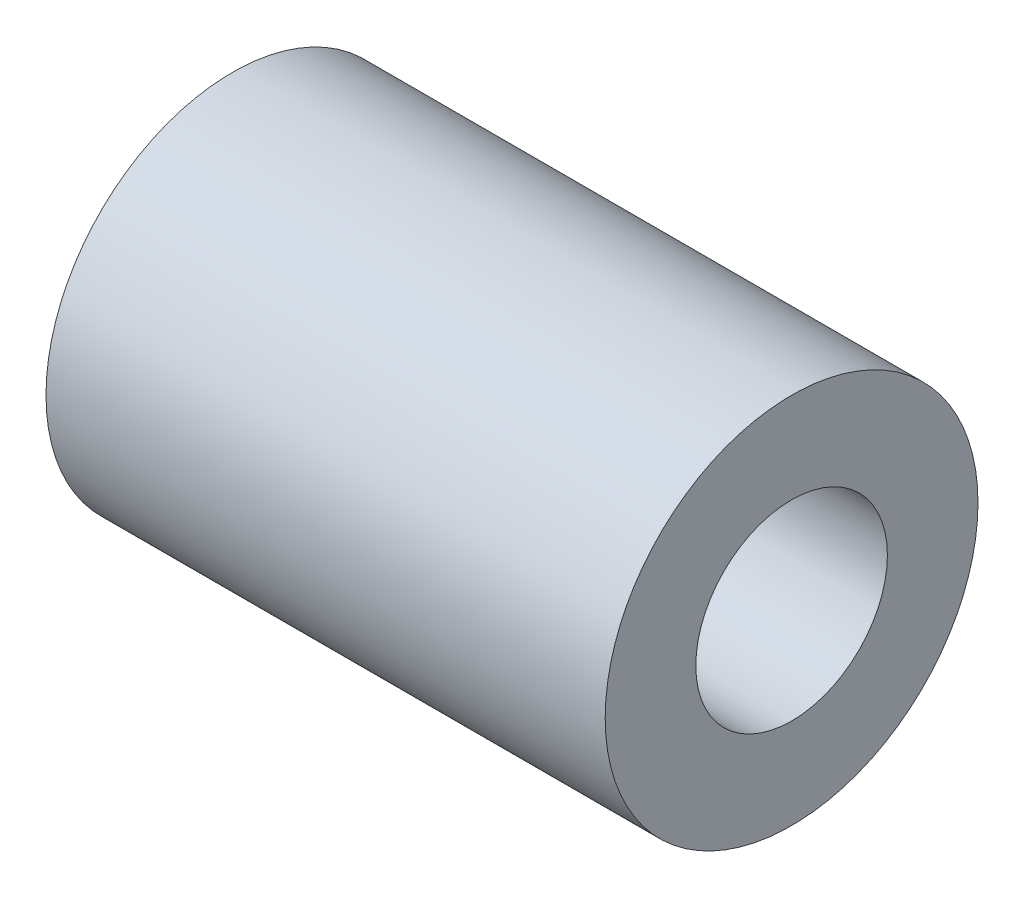
ISO-10303-21;
HEADER;
FILE_DESCRIPTION(('STEP AP214'),'2;1');
FILE_NAME('part.step','',(''),(''),'','','');
FILE_SCHEMA(('AUTOMOTIVE_DESIGN { 1 0 10303 214 1 1 1 1 }'));
ENDSEC;
DATA;
#1=APPLICATION_CONTEXT('core data for automotive mechanical design processes');
#2=APPLICATION_PROTOCOL_DEFINITION('international standard','automotive_design',2000,#1);
#3=PRODUCT_CONTEXT('',#1,'mechanical');
#4=PRODUCT('Part','Part','',(#3));
#5=PRODUCT_RELATED_PRODUCT_CATEGORY('part','',(#4));
#6=PRODUCT_DEFINITION_FORMATION('','',#4);
#7=PRODUCT_DEFINITION_CONTEXT('part definition',#1,'design');
#8=PRODUCT_DEFINITION('design','',#6,#7);
#9=PRODUCT_DEFINITION_SHAPE('','',#8);
#10=(LENGTH_UNIT() NAMED_UNIT(*) SI_UNIT(.MILLI.,.METRE.));
#11=(NAMED_UNIT(*) PLANE_ANGLE_UNIT() SI_UNIT($,.RADIAN.));
#12=(NAMED_UNIT(*) SI_UNIT($,.STERADIAN.) SOLID_ANGLE_UNIT());
#13=UNCERTAINTY_MEASURE_WITH_UNIT(LENGTH_MEASURE(1.E-05),#10,'distance_accuracy_value','');
#14=(GEOMETRIC_REPRESENTATION_CONTEXT(3) GLOBAL_UNCERTAINTY_ASSIGNED_CONTEXT((#13)) GLOBAL_UNIT_ASSIGNED_CONTEXT((#10,
#11,#12)) REPRESENTATION_CONTEXT('',''));
#15=CARTESIAN_POINT('',(0.,0.,0.));
#16=DIRECTION('',(0.,0.,1.));
#17=DIRECTION('',(1.,0.,0.));
#18=AXIS2_PLACEMENT_3D('',#15,#16,#17);
#19=CARTESIAN_POINT('',(19.05,0.,0.));
#20=DIRECTION('',(1.,0.,0.));
#21=DIRECTION('',(0.,0.,1.));
#22=AXIS2_PLACEMENT_3D('',#19,#20,#21);
#23=PLANE('',#22);
#24=CARTESIAN_POINT('',(19.05,0.,0.));
#25=DIRECTION('',(-1.,0.,0.));
#26=DIRECTION('',(0.,0.,1.));
#27=AXIS2_PLACEMENT_3D('',#24,#25,#26);
#28=CIRCLE('',#27,6.35);
#29=CARTESIAN_POINT('',(19.05,0.,-6.35));
#30=VERTEX_POINT('',#29);
#31=EDGE_CURVE('E10',#30,#30,#28,.T.);
#32=ORIENTED_EDGE('',*,*,#31,.F.);
#33=EDGE_LOOP('',(#32));
#34=FACE_BOUND('',#33,.T.);
#35=CARTESIAN_POINT('',(19.05,0.,0.));
#36=DIRECTION('',(-1.,0.,0.));
#37=DIRECTION('',(0.,0.,1.));
#38=AXIS2_PLACEMENT_3D('',#35,#36,#37);
#39=CIRCLE('',#38,3.2639);
#40=CARTESIAN_POINT('',(19.05,0.,-3.2639));
#41=VERTEX_POINT('',#40);
#42=EDGE_CURVE('E46',#41,#41,#39,.T.);
#43=ORIENTED_EDGE('',*,*,#42,.T.);
#44=EDGE_LOOP('',(#43));
#45=FACE_BOUND('',#44,.T.);
#46=ADVANCED_FACE('F35',(#34,#45),#23,.T.);
#47=CARTESIAN_POINT('',(0.,0.,0.));
#48=DIRECTION('',(1.,0.,0.));
#49=DIRECTION('',(0.,0.,1.));
#50=AXIS2_PLACEMENT_3D('',#47,#48,#49);
#51=PLANE('',#50);
#52=CARTESIAN_POINT('',(0.,0.,0.));
#53=DIRECTION('',(-1.,0.,0.));
#54=DIRECTION('',(0.,0.,1.));
#55=AXIS2_PLACEMENT_3D('',#52,#53,#54);
#56=CIRCLE('',#55,6.35);
#57=CARTESIAN_POINT('',(0.,0.,-6.35));
#58=VERTEX_POINT('',#57);
#59=EDGE_CURVE('E39',#58,#58,#56,.T.);
#60=ORIENTED_EDGE('',*,*,#59,.T.);
#61=EDGE_LOOP('',(#60));
#62=FACE_BOUND('',#61,.T.);
#63=CARTESIAN_POINT('',(0.,0.,0.));
#64=DIRECTION('',(-1.,0.,0.));
#65=DIRECTION('',(0.,0.,1.));
#66=AXIS2_PLACEMENT_3D('',#63,#64,#65);
#67=CIRCLE('',#66,3.2639);
#68=CARTESIAN_POINT('',(0.,0.,-3.2639));
#69=VERTEX_POINT('',#68);
#70=EDGE_CURVE('E48',#69,#69,#67,.T.);
#71=ORIENTED_EDGE('',*,*,#70,.F.);
#72=EDGE_LOOP('',(#71));
#73=FACE_BOUND('',#72,.T.);
#74=ADVANCED_FACE('F61',(#62,#73),#51,.F.);
#75=CARTESIAN_POINT('',(19.05,0.,0.));
#76=DIRECTION('',(-1.,0.,0.));
#77=DIRECTION('',(0.,0.,-1.));
#78=AXIS2_PLACEMENT_3D('',#75,#76,#77);
#79=CYLINDRICAL_SURFACE('',#78,6.35);
#80=CARTESIAN_POINT('',(19.05,0.,-6.35));
#81=CARTESIAN_POINT('',(18.8515625,0.,-6.35));
#82=CARTESIAN_POINT('',(18.653125,0.,-6.35));
#83=CARTESIAN_POINT('',(18.25625,0.,-6.35));
#84=CARTESIAN_POINT('',(18.0578125,0.,-6.35));
#85=CARTESIAN_POINT('',(17.6609375,0.,-6.35));
#86=CARTESIAN_POINT('',(17.4625,0.,-6.35));
#87=CARTESIAN_POINT('',(17.065625,0.,-6.35));
#88=CARTESIAN_POINT('',(16.8671875,0.,-6.35));
#89=CARTESIAN_POINT('',(16.4703125,0.,-6.35));
#90=CARTESIAN_POINT('',(16.271875,0.,-6.35));
#91=CARTESIAN_POINT('',(15.875,0.,-6.35));
#92=CARTESIAN_POINT('',(15.6765625,0.,-6.35));
#93=CARTESIAN_POINT('',(15.2796875,0.,-6.35));
#94=CARTESIAN_POINT('',(15.08125,0.,-6.35));
#95=CARTESIAN_POINT('',(14.684375,0.,-6.35));
#96=CARTESIAN_POINT('',(14.4859375,0.,-6.35));
#97=CARTESIAN_POINT('',(14.0890625,0.,-6.35));
#98=CARTESIAN_POINT('',(13.890625,0.,-6.35));
#99=CARTESIAN_POINT('',(13.49375,0.,-6.35));
#100=CARTESIAN_POINT('',(13.2953125,0.,-6.35));
#101=CARTESIAN_POINT('',(12.8984375,0.,-6.35));
#102=CARTESIAN_POINT('',(12.7,0.,-6.35));
#103=CARTESIAN_POINT('',(12.303125,0.,-6.35));
#104=CARTESIAN_POINT('',(12.1046875,0.,-6.35));
#105=CARTESIAN_POINT('',(11.7078125,0.,-6.35));
#106=CARTESIAN_POINT('',(11.509375,0.,-6.35));
#107=CARTESIAN_POINT('',(11.1125,0.,-6.35));
#108=CARTESIAN_POINT('',(10.9140625,0.,-6.35));
#109=CARTESIAN_POINT('',(10.5171875,0.,-6.35));
#110=CARTESIAN_POINT('',(10.31875,0.,-6.35));
#111=CARTESIAN_POINT('',(9.921875,0.,-6.35));
#112=CARTESIAN_POINT('',(9.7234375,0.,-6.35));
#113=CARTESIAN_POINT('',(9.3265625,0.,-6.35));
#114=CARTESIAN_POINT('',(9.128125,0.,-6.35));
#115=CARTESIAN_POINT('',(8.73125,0.,-6.35));
#116=CARTESIAN_POINT('',(8.5328125,0.,-6.35));
#117=CARTESIAN_POINT('',(8.1359375,0.,-6.35));
#118=CARTESIAN_POINT('',(7.9375,0.,-6.35));
#119=CARTESIAN_POINT('',(7.540625,0.,-6.35));
#120=CARTESIAN_POINT('',(7.3421875,0.,-6.35));
#121=CARTESIAN_POINT('',(6.9453125,0.,-6.35));
#122=CARTESIAN_POINT('',(6.746875,0.,-6.35));
#123=CARTESIAN_POINT('',(6.35,0.,-6.35));
#124=CARTESIAN_POINT('',(6.1515625,0.,-6.35));
#125=CARTESIAN_POINT('',(5.7546875,0.,-6.35));
#126=CARTESIAN_POINT('',(5.55625,0.,-6.35));
#127=CARTESIAN_POINT('',(5.159375,0.,-6.35));
#128=CARTESIAN_POINT('',(4.9609375,0.,-6.35));
#129=CARTESIAN_POINT('',(4.5640625,0.,-6.35));
#130=CARTESIAN_POINT('',(4.365625,0.,-6.35));
#131=CARTESIAN_POINT('',(3.96875,0.,-6.35));
#132=CARTESIAN_POINT('',(3.7703125,0.,-6.35));
#133=CARTESIAN_POINT('',(3.3734375,0.,-6.35));
#134=CARTESIAN_POINT('',(3.175,0.,-6.35));
#135=CARTESIAN_POINT('',(2.778125,0.,-6.35));
#136=CARTESIAN_POINT('',(2.5796875,0.,-6.35));
#137=CARTESIAN_POINT('',(2.1828125,0.,-6.35));
#138=CARTESIAN_POINT('',(1.984375,0.,-6.35));
#139=CARTESIAN_POINT('',(1.5875,0.,-6.35));
#140=CARTESIAN_POINT('',(1.3890625,0.,-6.35));
#141=CARTESIAN_POINT('',(0.992187500000001,0.,-6.35));
#142=CARTESIAN_POINT('',(0.793750000000001,0.,-6.35));
#143=CARTESIAN_POINT('',(0.396875,0.,-6.35));
#144=CARTESIAN_POINT('',(0.1984375,0.,-6.35));
#145=CARTESIAN_POINT('',(0.,0.,-6.35));
#146=B_SPLINE_CURVE_WITH_KNOTS('',3,(#80,#81,#82,#83,#84,#85,#86,#87,#88,#89,#90,#91,#92,#93,
#94,#95,#96,#97,#98,#99,#100,#101,#102,#103,#104,#105,#106,#107,#108,#109,#110,#111,#112,#113,
#114,#115,#116,#117,#118,#119,#120,#121,#122,#123,#124,#125,#126,#127,#128,#129,#130,#131,#132,
#133,#134,#135,#136,#137,#138,#139,#140,#141,#142,#143,#144,#145),.UNSPECIFIED.,.F.,.F.,(4,2,2,
2,2,2,2,2,2,2,2,2,2,2,2,2,2,2,2,2,2,2,2,2,2,2,2,2,2,2,2,2,4),(0.,0.595312499999997,1.190625,
1.7859375,2.38125,2.9765625,3.571875,4.1671875,4.7625,5.3578125,5.953125,6.5484375,7.14375,
7.7390625,8.334375,8.9296875,9.525,10.1203125,10.715625,11.3109375,11.90625,12.5015625,
13.096875,13.6921875,14.2875,14.8828125,15.478125,16.0734375,16.66875,17.2640625,17.859375,
18.4546875,19.05),.UNSPECIFIED.);
#147=EDGE_CURVE('BSEAM37',#30,#58,#146,.T.);
#148=ORIENTED_EDGE('',*,*,#31,.T.);
#149=ORIENTED_EDGE('',*,*,#59,.F.);
#150=ORIENTED_EDGE('',*,*,#147,.T.);
#151=ORIENTED_EDGE('',*,*,#147,.F.);
#152=EDGE_LOOP('',(#148,#150,#149,#151));
#153=FACE_BOUND('',#152,.T.);
#154=ADVANCED_FACE('F37',(#153),#79,.T.);
#155=CARTESIAN_POINT('',(19.05,0.,0.));
#156=DIRECTION('',(-1.,0.,0.));
#157=DIRECTION('',(0.,0.,-1.));
#158=AXIS2_PLACEMENT_3D('',#155,#156,#157);
#159=CYLINDRICAL_SURFACE('',#158,3.2639);
#160=CARTESIAN_POINT('',(19.05,0.,-3.2639));
#161=CARTESIAN_POINT('',(18.8515625,0.,-3.2639));
#162=CARTESIAN_POINT('',(18.653125,0.,-3.2639));
#163=CARTESIAN_POINT('',(18.25625,0.,-3.2639));
#164=CARTESIAN_POINT('',(18.0578125,0.,-3.2639));
#165=CARTESIAN_POINT('',(17.6609375,0.,-3.2639));
#166=CARTESIAN_POINT('',(17.4625,0.,-3.2639));
#167=CARTESIAN_POINT('',(17.065625,0.,-3.2639));
#168=CARTESIAN_POINT('',(16.8671875,0.,-3.2639));
#169=CARTESIAN_POINT('',(16.4703125,0.,-3.2639));
#170=CARTESIAN_POINT('',(16.271875,0.,-3.2639));
#171=CARTESIAN_POINT('',(15.875,0.,-3.2639));
#172=CARTESIAN_POINT('',(15.6765625,0.,-3.2639));
#173=CARTESIAN_POINT('',(15.2796875,0.,-3.2639));
#174=CARTESIAN_POINT('',(15.08125,0.,-3.2639));
#175=CARTESIAN_POINT('',(14.684375,0.,-3.2639));
#176=CARTESIAN_POINT('',(14.4859375,0.,-3.2639));
#177=CARTESIAN_POINT('',(14.0890625,0.,-3.2639));
#178=CARTESIAN_POINT('',(13.890625,0.,-3.2639));
#179=CARTESIAN_POINT('',(13.49375,0.,-3.2639));
#180=CARTESIAN_POINT('',(13.2953125,0.,-3.2639));
#181=CARTESIAN_POINT('',(12.8984375,0.,-3.2639));
#182=CARTESIAN_POINT('',(12.7,0.,-3.2639));
#183=CARTESIAN_POINT('',(12.303125,0.,-3.2639));
#184=CARTESIAN_POINT('',(12.1046875,0.,-3.2639));
#185=CARTESIAN_POINT('',(11.7078125,0.,-3.2639));
#186=CARTESIAN_POINT('',(11.509375,0.,-3.2639));
#187=CARTESIAN_POINT('',(11.1125,0.,-3.2639));
#188=CARTESIAN_POINT('',(10.9140625,0.,-3.2639));
#189=CARTESIAN_POINT('',(10.5171875,0.,-3.2639));
#190=CARTESIAN_POINT('',(10.31875,0.,-3.2639));
#191=CARTESIAN_POINT('',(9.921875,0.,-3.2639));
#192=CARTESIAN_POINT('',(9.7234375,0.,-3.2639));
#193=CARTESIAN_POINT('',(9.3265625,0.,-3.2639));
#194=CARTESIAN_POINT('',(9.128125,0.,-3.2639));
#195=CARTESIAN_POINT('',(8.73125,0.,-3.2639));
#196=CARTESIAN_POINT('',(8.5328125,0.,-3.2639));
#197=CARTESIAN_POINT('',(8.1359375,0.,-3.2639));
#198=CARTESIAN_POINT('',(7.9375,0.,-3.2639));
#199=CARTESIAN_POINT('',(7.540625,0.,-3.2639));
#200=CARTESIAN_POINT('',(7.3421875,0.,-3.2639));
#201=CARTESIAN_POINT('',(6.9453125,0.,-3.2639));
#202=CARTESIAN_POINT('',(6.746875,0.,-3.2639));
#203=CARTESIAN_POINT('',(6.35,0.,-3.2639));
#204=CARTESIAN_POINT('',(6.1515625,0.,-3.2639));
#205=CARTESIAN_POINT('',(5.7546875,0.,-3.2639));
#206=CARTESIAN_POINT('',(5.55625,0.,-3.2639));
#207=CARTESIAN_POINT('',(5.159375,0.,-3.2639));
#208=CARTESIAN_POINT('',(4.9609375,0.,-3.2639));
#209=CARTESIAN_POINT('',(4.5640625,0.,-3.2639));
#210=CARTESIAN_POINT('',(4.365625,0.,-3.2639));
#211=CARTESIAN_POINT('',(3.96875,0.,-3.2639));
#212=CARTESIAN_POINT('',(3.7703125,0.,-3.2639));
#213=CARTESIAN_POINT('',(3.3734375,0.,-3.2639));
#214=CARTESIAN_POINT('',(3.175,0.,-3.2639));
#215=CARTESIAN_POINT('',(2.778125,0.,-3.2639));
#216=CARTESIAN_POINT('',(2.5796875,0.,-3.2639));
#217=CARTESIAN_POINT('',(2.1828125,0.,-3.2639));
#218=CARTESIAN_POINT('',(1.984375,0.,-3.2639));
#219=CARTESIAN_POINT('',(1.5875,0.,-3.2639));
#220=CARTESIAN_POINT('',(1.3890625,0.,-3.2639));
#221=CARTESIAN_POINT('',(0.992187500000001,0.,-3.2639));
#222=CARTESIAN_POINT('',(0.793750000000001,0.,-3.2639));
#223=CARTESIAN_POINT('',(0.396875,0.,-3.2639));
#224=CARTESIAN_POINT('',(0.1984375,0.,-3.2639));
#225=CARTESIAN_POINT('',(0.,0.,-3.2639));
#226=B_SPLINE_CURVE_WITH_KNOTS('',3,(#160,#161,#162,#163,#164,#165,#166,#167,#168,#169,#170,
#171,#172,#173,#174,#175,#176,#177,#178,#179,#180,#181,#182,#183,#184,#185,#186,#187,#188,#189,
#190,#191,#192,#193,#194,#195,#196,#197,#198,#199,#200,#201,#202,#203,#204,#205,#206,#207,#208,
#209,#210,#211,#212,#213,#214,#215,#216,#217,#218,#219,#220,#221,#222,#223,#224,#225),
.UNSPECIFIED.,.F.,.F.,(4,2,2,2,2,2,2,2,2,2,2,2,2,2,2,2,2,2,2,2,2,2,2,2,2,2,2,2,2,2,2,2,4),(0.,
0.5953125,1.190625,1.7859375,2.38125,2.9765625,3.571875,4.1671875,4.7625,5.3578125,5.953125,
6.5484375,7.14375,7.7390625,8.334375,8.9296875,9.525,10.1203125,10.715625,11.3109375,11.90625,
12.5015625,13.096875,13.6921875,14.2875,14.8828125,15.478125,16.0734375,16.66875,17.2640625,
17.859375,18.4546875,19.05),.UNSPECIFIED.);
#227=EDGE_CURVE('BSEAM55',#41,#69,#226,.T.);
#228=ORIENTED_EDGE('',*,*,#42,.F.);
#229=ORIENTED_EDGE('',*,*,#70,.T.);
#230=ORIENTED_EDGE('',*,*,#227,.T.);
#231=ORIENTED_EDGE('',*,*,#227,.F.);
#232=EDGE_LOOP('',(#228,#230,#229,#231));
#233=FACE_BOUND('',#232,.T.);
#234=ADVANCED_FACE('F55',(#233),#159,.F.);
#235=CLOSED_SHELL('',(#46,#74,#154,#234));
#236=MANIFOLD_SOLID_BREP('B2',#235);
#237=ADVANCED_BREP_SHAPE_REPRESENTATION('',(#18,#236),#14);
#238=SHAPE_DEFINITION_REPRESENTATION(#9,#237);
ENDSEC;
END-ISO-10303-21;
